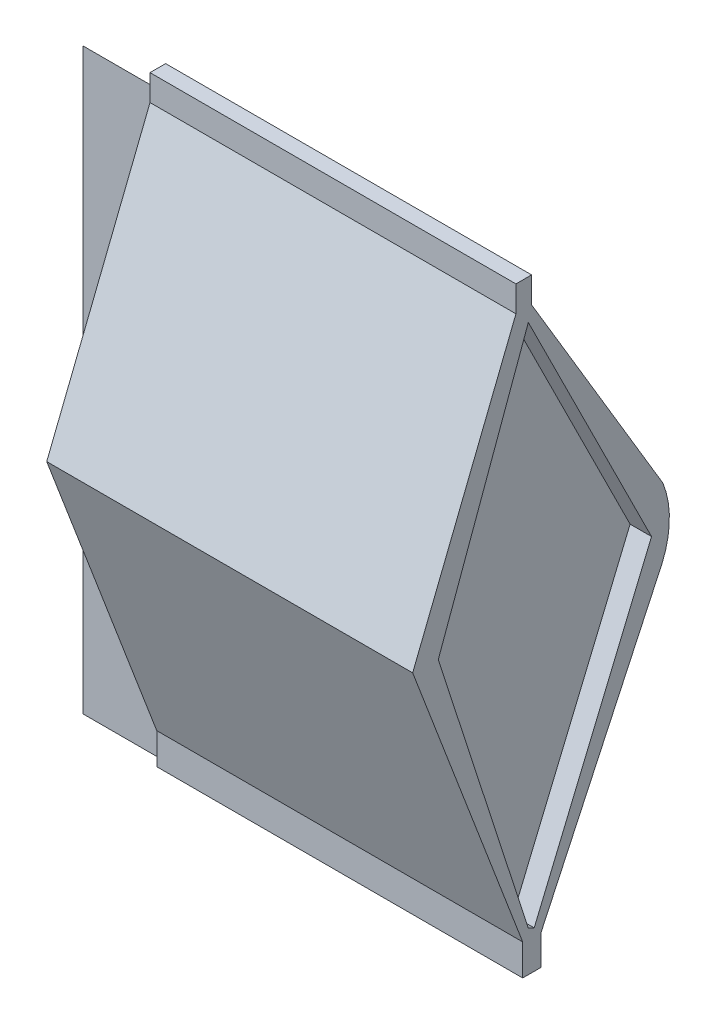
ISO-10303-21;
HEADER;
FILE_DESCRIPTION(('STEP AP214'),'2;1');
FILE_NAME('part.step','',(''),(''),'','','');
FILE_SCHEMA(('AUTOMOTIVE_DESIGN { 1 0 10303 214 1 1 1 1 }'));
ENDSEC;
DATA;
#1=APPLICATION_CONTEXT('core data for automotive mechanical design processes');
#2=APPLICATION_PROTOCOL_DEFINITION('international standard','automotive_design',2000,#1);
#3=PRODUCT_CONTEXT('',#1,'mechanical');
#4=PRODUCT('Part','Part','',(#3));
#5=PRODUCT_RELATED_PRODUCT_CATEGORY('part','',(#4));
#6=PRODUCT_DEFINITION_FORMATION('','',#4);
#7=PRODUCT_DEFINITION_CONTEXT('part definition',#1,'design');
#8=PRODUCT_DEFINITION('design','',#6,#7);
#9=PRODUCT_DEFINITION_SHAPE('','',#8);
#10=(LENGTH_UNIT() NAMED_UNIT(*) SI_UNIT(.MILLI.,.METRE.));
#11=(NAMED_UNIT(*) PLANE_ANGLE_UNIT() SI_UNIT($,.RADIAN.));
#12=(NAMED_UNIT(*) SI_UNIT($,.STERADIAN.) SOLID_ANGLE_UNIT());
#13=UNCERTAINTY_MEASURE_WITH_UNIT(LENGTH_MEASURE(1.E-05),#10,'distance_accuracy_value','');
#14=(GEOMETRIC_REPRESENTATION_CONTEXT(3) GLOBAL_UNCERTAINTY_ASSIGNED_CONTEXT((#13)) GLOBAL_UNIT_ASSIGNED_CONTEXT((#10,
#11,#12)) REPRESENTATION_CONTEXT('',''));
#15=CARTESIAN_POINT('',(0.,0.,0.));
#16=DIRECTION('',(0.,0.,1.));
#17=DIRECTION('',(1.,0.,0.));
#18=AXIS2_PLACEMENT_3D('',#15,#16,#17);
#19=CARTESIAN_POINT('',(-31.4181155350113,42.3611282868526,50.));
#20=DIRECTION('',(1.,0.,0.));
#21=DIRECTION('',(0.,0.,-1.));
#22=AXIS2_PLACEMENT_3D('',#19,#20,#21);
#23=PLANE('',#22);
#24=DIRECTION('',(0.,-1.,0.));
#25=VECTOR('',#24,1.);
#26=CARTESIAN_POINT('',(-31.4181155350113,42.3611282868526,29.6553839692635));
#27=LINE('',#26,#25);
#28=CARTESIAN_POINT('',(-31.4181155350113,38.7225544726135,29.6553839692635));
#29=VERTEX_POINT('',#28);
#30=CARTESIAN_POINT('',(-31.4181155350113,-42.3611282868526,29.6553839692635));
#31=VERTEX_POINT('',#30);
#32=EDGE_CURVE('E291',#29,#31,#27,.T.);
#33=ORIENTED_EDGE('',*,*,#32,.F.);
#34=DIRECTION('',(0.,-0.85862241369767,-0.512608574543957));
#35=VECTOR('',#34,1.);
#36=CARTESIAN_POINT('',(-31.4181155350113,50.3594517276258,36.6027606261541));
#37=LINE('',#36,#35);
#38=CARTESIAN_POINT('',(-31.4181155350113,7.92449718438055,11.2685494382899));
#39=VERTEX_POINT('',#38);
#40=EDGE_CURVE('E179',#29,#39,#37,.T.);
#41=ORIENTED_EDGE('',*,*,#40,.T.);
#42=CARTESIAN_POINT('',(-31.4181155350113,3.18000076873502,22.9457580114657));
#43=DIRECTION('',(1.,0.,0.));
#44=DIRECTION('',(0.,0.,1.));
#45=AXIS2_PLACEMENT_3D('',#42,#43,#44);
#46=CIRCLE('',#45,12.6042630208801);
#47=CARTESIAN_POINT('',(-31.4181155350113,-1.76687908687424,11.3528366370368));
#48=VERTEX_POINT('',#47);
#49=EDGE_CURVE('E229',#48,#39,#46,.T.);
#50=ORIENTED_EDGE('',*,*,#49,.F.);
#51=DIRECTION('',(0.,-0.906069641419884,0.423128591443834));
#52=VECTOR('',#51,1.);
#53=CARTESIAN_POINT('',(-31.4181155350113,19.6438437493998,1.35416922631763));
#54=LINE('',#53,#52);
#55=CARTESIAN_POINT('',(-31.4181155350113,-38.1177449997665,28.3284530668979));
#56=VERTEX_POINT('',#55);
#57=EDGE_CURVE('E40',#48,#56,#54,.T.);
#58=ORIENTED_EDGE('',*,*,#57,.T.);
#59=DIRECTION('',(0.,-1.,0.));
#60=VECTOR('',#59,1.);
#61=CARTESIAN_POINT('',(-31.4181155350113,42.3611282868526,28.3284530668979));
#62=LINE('',#61,#60);
#63=CARTESIAN_POINT('',(-31.4181155350113,-42.3611282868526,28.3284530668979));
#64=VERTEX_POINT('',#63);
#65=EDGE_CURVE('E182',#56,#64,#62,.T.);
#66=ORIENTED_EDGE('',*,*,#65,.T.);
#67=DIRECTION('',(0.,0.,-1.));
#68=VECTOR('',#67,1.);
#69=CARTESIAN_POINT('',(-31.4181155350113,-42.3611282868526,50.));
#70=LINE('',#69,#68);
#71=EDGE_CURVE('E215',#31,#64,#70,.T.);
#72=ORIENTED_EDGE('',*,*,#71,.F.);
#73=EDGE_LOOP('',(#33,#41,#50,#58,#66,#72));
#74=FACE_BOUND('',#73,.T.);
#75=ADVANCED_FACE('F32',(#74),#23,.F.);
#76=CARTESIAN_POINT('',(31.4181155350113,42.3611282868526,50.));
#77=DIRECTION('',(-1.,0.,0.));
#78=DIRECTION('',(0.,0.,1.));
#79=AXIS2_PLACEMENT_3D('',#76,#77,#78);
#80=PLANE('',#79);
#81=DIRECTION('',(0.,-0.939498101775437,0.34255410778496));
#82=VECTOR('',#81,1.);
#83=CARTESIAN_POINT('',(31.4181155350113,36.8174357474018,30.1115989208824));
#84=LINE('',#83,#82);
#85=CARTESIAN_POINT('',(31.4181155350113,36.8174357474018,30.1115989208824));
#86=VERTEX_POINT('',#85);
#87=CARTESIAN_POINT('',(31.4181155350113,2.19595341030754,42.7350741251047));
#88=VERTEX_POINT('',#87);
#89=EDGE_CURVE('E273',#86,#88,#84,.T.);
#90=ORIENTED_EDGE('',*,*,#89,.F.);
#91=DIRECTION('',(0.,0.894888871151744,0.446289041192766));
#92=VECTOR('',#91,1.);
#93=CARTESIAN_POINT('',(31.4181155350113,2.19595341030754,12.8455576782329));
#94=LINE('',#93,#92);
#95=CARTESIAN_POINT('',(31.4181155350113,2.19595341030754,12.8455576782329));
#96=VERTEX_POINT('',#95);
#97=EDGE_CURVE('E55',#96,#86,#94,.T.);
#98=ORIENTED_EDGE('',*,*,#97,.F.);
#99=DIRECTION('',(0.,0.922414525454659,-0.386201298845896));
#100=VECTOR('',#99,1.);
#101=CARTESIAN_POINT('',(31.4181155350113,-37.0782013501156,29.2890645409137));
#102=LINE('',#101,#100);
#103=CARTESIAN_POINT('',(31.4181155350113,-37.0782013501156,29.2890645409137));
#104=VERTEX_POINT('',#103);
#105=EDGE_CURVE('E263',#104,#96,#102,.T.);
#106=ORIENTED_EDGE('',*,*,#105,.F.);
#107=DIRECTION('',(0.,-0.423128591443833,-0.906069641419884));
#108=VECTOR('',#107,1.);
#109=CARTESIAN_POINT('',(31.4181155350113,-36.6940831789506,30.1115989208824));
#110=LINE('',#109,#108);
#111=CARTESIAN_POINT('',(31.4181155350113,-36.6940831789506,30.1115989208824));
#112=VERTEX_POINT('',#111);
#113=EDGE_CURVE('E267',#112,#104,#110,.T.);
#114=ORIENTED_EDGE('',*,*,#113,.F.);
#115=DIRECTION('',(0.,-0.951147499434773,-0.308736836673207));
#116=VECTOR('',#115,1.);
#117=CARTESIAN_POINT('',(31.4181155350113,2.19595341030754,42.7350741251047));
#118=LINE('',#117,#116);
#119=EDGE_CURVE('E270',#88,#112,#118,.T.);
#120=ORIENTED_EDGE('',*,*,#119,.F.);
#121=EDGE_LOOP('',(#90,#98,#106,#114,#120));
#122=FACE_BOUND('',#121,.T.);
#123=DIRECTION('',(0.,-0.906069641419884,0.423128591443834));
#124=VECTOR('',#123,1.);
#125=CARTESIAN_POINT('',(31.4181155350113,3.75015887750862,8.77641602200185));
#126=LINE('',#125,#124);
#127=CARTESIAN_POINT('',(31.4181155350113,-1.76687908687419,11.3528366370367));
#128=VERTEX_POINT('',#127);
#129=CARTESIAN_POINT('',(31.4181155350113,-38.1177449997665,28.3284530668979));
#130=VERTEX_POINT('',#129);
#131=EDGE_CURVE('E239',#128,#130,#126,.T.);
#132=ORIENTED_EDGE('',*,*,#131,.F.);
#133=CARTESIAN_POINT('',(31.4181155350113,3.18000076873502,22.9457580114657));
#134=DIRECTION('',(-1.,0.,0.));
#135=DIRECTION('',(0.,0.,1.));
#136=AXIS2_PLACEMENT_3D('',#133,#134,#135);
#137=CIRCLE('',#136,12.6042630208801);
#138=CARTESIAN_POINT('',(31.4181155350113,7.92449718438057,11.2685494382899));
#139=VERTEX_POINT('',#138);
#140=EDGE_CURVE('E249',#128,#139,#137,.F.);
#141=ORIENTED_EDGE('',*,*,#140,.T.);
#142=DIRECTION('',(0.,-0.85862241369767,-0.512608574543957));
#143=VECTOR('',#142,1.);
#144=CARTESIAN_POINT('',(31.4181155350113,38.7225544726135,29.6553839692635));
#145=LINE('',#144,#143);
#146=CARTESIAN_POINT('',(31.4181155350113,38.7225544726135,29.6553839692635));
#147=VERTEX_POINT('',#146);
#148=EDGE_CURVE('E243',#147,#139,#145,.T.);
#149=ORIENTED_EDGE('',*,*,#148,.F.);
#150=DIRECTION('',(0.,-1.,0.));
#151=VECTOR('',#150,1.);
#152=CARTESIAN_POINT('',(31.4181155350113,42.3611282868526,29.6553839692635));
#153=LINE('',#152,#151);
#154=CARTESIAN_POINT('',(31.4181155350113,42.3611282868526,29.6553839692635));
#155=VERTEX_POINT('',#154);
#156=EDGE_CURVE('E172',#155,#147,#153,.T.);
#157=ORIENTED_EDGE('',*,*,#156,.F.);
#158=DIRECTION('',(0.,0.,-1.));
#159=VECTOR('',#158,1.);
#160=CARTESIAN_POINT('',(31.4181155350113,42.3611282868526,50.));
#161=LINE('',#160,#159);
#162=CARTESIAN_POINT('',(31.4181155350113,42.3611282868526,31.846034256688));
#163=VERTEX_POINT('',#162);
#164=EDGE_CURVE('E217',#163,#155,#161,.T.);
#165=ORIENTED_EDGE('',*,*,#164,.F.);
#166=DIRECTION('',(0.,-1.,0.));
#167=VECTOR('',#166,1.);
#168=CARTESIAN_POINT('',(31.4181155350113,0.,31.846034256688));
#169=LINE('',#168,#167);
#170=CARTESIAN_POINT('',(31.4181155350113,38.7281740079146,31.846034256688));
#171=VERTEX_POINT('',#170);
#172=EDGE_CURVE('E193',#163,#171,#169,.T.);
#173=ORIENTED_EDGE('',*,*,#172,.T.);
#174=DIRECTION('',(0.,-0.928999989043887,0.370079748644069));
#175=VECTOR('',#174,1.);
#176=CARTESIAN_POINT('',(31.4181155350113,16.252969359155,40.7993369318552));
#177=LINE('',#176,#175);
#178=CARTESIAN_POINT('',(31.4181155350113,2.38891708981726,46.3222702359829));
#179=VERTEX_POINT('',#178);
#180=EDGE_CURVE('E190',#171,#179,#177,.T.);
#181=ORIENTED_EDGE('',*,*,#180,.T.);
#182=DIRECTION('',(0.,-0.934146484006521,-0.356889823920849));
#183=VECTOR('',#182,1.);
#184=CARTESIAN_POINT('',(31.4181155350113,-15.1389828433554,39.6257518334059));
#185=LINE('',#184,#183);
#186=CARTESIAN_POINT('',(31.4181155350113,-37.9824267264439,30.8984346462609));
#187=VERTEX_POINT('',#186);
#188=EDGE_CURVE('E199',#179,#187,#185,.T.);
#189=ORIENTED_EDGE('',*,*,#188,.T.);
#190=DIRECTION('',(0.,-1.,0.));
#191=VECTOR('',#190,1.);
#192=CARTESIAN_POINT('',(31.4181155350113,0.,30.8984346462609));
#193=LINE('',#192,#191);
#194=CARTESIAN_POINT('',(31.4181155350113,-42.3611282868526,30.8984346462609));
#195=VERTEX_POINT('',#194);
#196=EDGE_CURVE('E196',#187,#195,#193,.T.);
#197=ORIENTED_EDGE('',*,*,#196,.T.);
#198=DIRECTION('',(0.,0.,-1.));
#199=VECTOR('',#198,1.);
#200=CARTESIAN_POINT('',(31.4181155350113,-42.3611282868526,50.));
#201=LINE('',#200,#199);
#202=CARTESIAN_POINT('',(31.4181155350113,-42.3611282868526,28.3284530668979));
#203=VERTEX_POINT('',#202);
#204=EDGE_CURVE('E205',#195,#203,#201,.T.);
#205=ORIENTED_EDGE('',*,*,#204,.T.);
#206=DIRECTION('',(0.,-1.,0.));
#207=VECTOR('',#206,1.);
#208=CARTESIAN_POINT('',(31.4181155350113,-38.1177449997665,28.3284530668979));
#209=LINE('',#208,#207);
#210=EDGE_CURVE('E187',#130,#203,#209,.T.);
#211=ORIENTED_EDGE('',*,*,#210,.F.);
#212=EDGE_LOOP('',(#132,#141,#149,#157,#165,#173,#181,#189,#197,#205,#211));
#213=FACE_BOUND('',#212,.T.);
#214=ADVANCED_FACE('F34',(#122,#213),#80,.F.);
#215=CARTESIAN_POINT('',(-31.4181155350113,42.3611282868526,50.));
#216=DIRECTION('',(0.,-1.,0.));
#217=DIRECTION('',(0.,0.,-1.));
#218=AXIS2_PLACEMENT_3D('',#215,#216,#217);
#219=PLANE('',#218);
#220=DIRECTION('',(1.,0.,0.));
#221=VECTOR('',#220,1.);
#222=CARTESIAN_POINT('',(-48.5818844649887,42.3611282868526,29.6553839692635));
#223=LINE('',#222,#221);
#224=CARTESIAN_POINT('',(-19.8699083028941,42.3611282868526,29.6553839692635));
#225=VERTEX_POINT('',#224);
#226=EDGE_CURVE('E175',#225,#155,#223,.T.);
#227=ORIENTED_EDGE('',*,*,#226,.F.);
#228=DIRECTION('',(0.,0.,-1.));
#229=VECTOR('',#228,1.);
#230=CARTESIAN_POINT('',(-19.8699083028941,42.3611282868526,109.655383969263));
#231=LINE('',#230,#229);
#232=CARTESIAN_POINT('',(-19.8699083028941,42.3611282868526,31.846034256688));
#233=VERTEX_POINT('',#232);
#234=EDGE_CURVE('E47',#233,#225,#231,.T.);
#235=ORIENTED_EDGE('',*,*,#234,.F.);
#236=DIRECTION('',(1.,0.,0.));
#237=VECTOR('',#236,1.);
#238=CARTESIAN_POINT('',(-48.5818844649887,42.3611282868526,31.846034256688));
#239=LINE('',#238,#237);
#240=EDGE_CURVE('E210',#233,#163,#239,.T.);
#241=ORIENTED_EDGE('',*,*,#240,.T.);
#242=ORIENTED_EDGE('',*,*,#164,.T.);
#243=EDGE_LOOP('',(#227,#235,#241,#242));
#244=FACE_BOUND('',#243,.T.);
#245=ADVANCED_FACE('F327',(#244),#219,.F.);
#246=CARTESIAN_POINT('',(-31.4181155350113,-42.3611282868526,50.));
#247=DIRECTION('',(0.,1.,0.));
#248=DIRECTION('',(0.,0.,1.));
#249=AXIS2_PLACEMENT_3D('',#246,#247,#248);
#250=PLANE('',#249);
#251=DIRECTION('',(1.,0.,0.));
#252=VECTOR('',#251,1.);
#253=CARTESIAN_POINT('',(-48.5818844649887,-42.3611282868526,30.8984346462609));
#254=LINE('',#253,#252);
#255=CARTESIAN_POINT('',(-19.8699083028941,-42.3611282868526,30.8984346462609));
#256=VERTEX_POINT('',#255);
#257=EDGE_CURVE('E208',#256,#195,#254,.T.);
#258=ORIENTED_EDGE('',*,*,#257,.F.);
#259=DIRECTION('',(0.,0.,-1.));
#260=VECTOR('',#259,1.);
#261=CARTESIAN_POINT('',(-19.8699083028941,-42.3611282868526,50.));
#262=LINE('',#261,#260);
#263=CARTESIAN_POINT('',(-19.8699083028941,-42.3611282868526,29.6553839692635));
#264=VERTEX_POINT('',#263);
#265=EDGE_CURVE('E295',#256,#264,#262,.T.);
#266=ORIENTED_EDGE('',*,*,#265,.T.);
#267=DIRECTION('',(1.,0.,0.));
#268=VECTOR('',#267,1.);
#269=CARTESIAN_POINT('',(-31.4181155350113,-42.3611282868526,29.6553839692635));
#270=LINE('',#269,#268);
#271=EDGE_CURVE('E160',#31,#264,#270,.T.);
#272=ORIENTED_EDGE('',*,*,#271,.F.);
#273=ORIENTED_EDGE('',*,*,#71,.T.);
#274=DIRECTION('',(1.,0.,0.));
#275=VECTOR('',#274,1.);
#276=CARTESIAN_POINT('',(-31.4181155350113,-42.3611282868526,28.3284530668979));
#277=LINE('',#276,#275);
#278=EDGE_CURVE('E220',#64,#203,#277,.T.);
#279=ORIENTED_EDGE('',*,*,#278,.T.);
#280=ORIENTED_EDGE('',*,*,#204,.F.);
#281=EDGE_LOOP('',(#258,#266,#272,#273,#279,#280));
#282=FACE_BOUND('',#281,.T.);
#283=ADVANCED_FACE('F348',(#282),#250,.F.);
#284=CARTESIAN_POINT('',(-48.5818844649887,16.252969359155,40.7993369318552));
#285=DIRECTION('',(0.,0.370079748644069,0.928999989043887));
#286=DIRECTION('',(0.,-0.928999989043887,0.370079748644069));
#287=AXIS2_PLACEMENT_3D('',#284,#285,#286);
#288=PLANE('',#287);
#289=DIRECTION('',(0.,0.928999989043887,-0.370079748644069));
#290=VECTOR('',#289,1.);
#291=CARTESIAN_POINT('',(-19.8699083028941,16.252969359155,40.7993369318552));
#292=LINE('',#291,#290);
#293=CARTESIAN_POINT('',(-19.8699083028941,2.38891708981726,46.3222702359829));
#294=VERTEX_POINT('',#293);
#295=CARTESIAN_POINT('',(-19.8699083028941,38.7281740079146,31.846034256688));
#296=VERTEX_POINT('',#295);
#297=EDGE_CURVE('E297',#294,#296,#292,.T.);
#298=ORIENTED_EDGE('',*,*,#297,.F.);
#299=DIRECTION('',(1.,0.,0.));
#300=VECTOR('',#299,1.);
#301=CARTESIAN_POINT('',(-48.5818844649887,2.38891708981726,46.3222702359829));
#302=LINE('',#301,#300);
#303=EDGE_CURVE('E203',#294,#179,#302,.T.);
#304=ORIENTED_EDGE('',*,*,#303,.T.);
#305=ORIENTED_EDGE('',*,*,#180,.F.);
#306=DIRECTION('',(1.,0.,0.));
#307=VECTOR('',#306,1.);
#308=CARTESIAN_POINT('',(-48.5818844649887,38.7281740079146,31.846034256688));
#309=LINE('',#308,#307);
#310=EDGE_CURVE('E202',#296,#171,#309,.T.);
#311=ORIENTED_EDGE('',*,*,#310,.F.);
#312=EDGE_LOOP('',(#298,#304,#305,#311));
#313=FACE_BOUND('',#312,.T.);
#314=ADVANCED_FACE('F321',(#313),#288,.T.);
#315=CARTESIAN_POINT('',(-48.5818844649887,-15.1389828433554,39.6257518334059));
#316=DIRECTION('',(0.,-0.356889823920849,0.934146484006521));
#317=DIRECTION('',(0.,-0.934146484006521,-0.356889823920849));
#318=AXIS2_PLACEMENT_3D('',#315,#316,#317);
#319=PLANE('',#318);
#320=DIRECTION('',(0.,0.934146484006521,0.356889823920849));
#321=VECTOR('',#320,1.);
#322=CARTESIAN_POINT('',(-19.8699083028941,-15.1389828433554,39.6257518334059));
#323=LINE('',#322,#321);
#324=CARTESIAN_POINT('',(-19.8699083028941,-37.9824267264439,30.8984346462609));
#325=VERTEX_POINT('',#324);
#326=EDGE_CURVE('E299',#325,#294,#323,.T.);
#327=ORIENTED_EDGE('',*,*,#326,.F.);
#328=DIRECTION('',(1.,0.,0.));
#329=VECTOR('',#328,1.);
#330=CARTESIAN_POINT('',(-48.5818844649887,-37.9824267264439,30.8984346462609));
#331=LINE('',#330,#329);
#332=EDGE_CURVE('E206',#325,#187,#331,.T.);
#333=ORIENTED_EDGE('',*,*,#332,.T.);
#334=ORIENTED_EDGE('',*,*,#188,.F.);
#335=ORIENTED_EDGE('',*,*,#303,.F.);
#336=EDGE_LOOP('',(#327,#333,#334,#335));
#337=FACE_BOUND('',#336,.T.);
#338=ADVANCED_FACE('F311',(#337),#319,.T.);
#339=CARTESIAN_POINT('',(-48.5818844649887,0.,31.846034256688));
#340=DIRECTION('',(0.,0.,1.));
#341=DIRECTION('',(1.,0.,0.));
#342=AXIS2_PLACEMENT_3D('',#339,#340,#341);
#343=PLANE('',#342);
#344=DIRECTION('',(0.,1.,0.));
#345=VECTOR('',#344,1.);
#346=CARTESIAN_POINT('',(-19.8699083028941,0.,31.846034256688));
#347=LINE('',#346,#345);
#348=EDGE_CURVE('E293',#296,#233,#347,.T.);
#349=ORIENTED_EDGE('',*,*,#348,.F.);
#350=ORIENTED_EDGE('',*,*,#310,.T.);
#351=ORIENTED_EDGE('',*,*,#172,.F.);
#352=ORIENTED_EDGE('',*,*,#240,.F.);
#353=EDGE_LOOP('',(#349,#350,#351,#352));
#354=FACE_BOUND('',#353,.T.);
#355=ADVANCED_FACE('F325',(#354),#343,.T.);
#356=CARTESIAN_POINT('',(-48.5818844649887,0.,30.8984346462609));
#357=DIRECTION('',(0.,0.,1.));
#358=DIRECTION('',(1.,0.,0.));
#359=AXIS2_PLACEMENT_3D('',#356,#357,#358);
#360=PLANE('',#359);
#361=DIRECTION('',(0.,1.,0.));
#362=VECTOR('',#361,1.);
#363=CARTESIAN_POINT('',(-19.8699083028941,0.,30.8984346462609));
#364=LINE('',#363,#362);
#365=EDGE_CURVE('E301',#256,#325,#364,.T.);
#366=ORIENTED_EDGE('',*,*,#365,.F.);
#367=ORIENTED_EDGE('',*,*,#257,.T.);
#368=ORIENTED_EDGE('',*,*,#196,.F.);
#369=ORIENTED_EDGE('',*,*,#332,.F.);
#370=EDGE_LOOP('',(#366,#367,#368,#369));
#371=FACE_BOUND('',#370,.T.);
#372=ADVANCED_FACE('F314',(#371),#360,.T.);
#373=CARTESIAN_POINT('',(-48.5818844649887,3.75015887750862,8.77641602200185));
#374=DIRECTION('',(0.,0.423128591443834,0.906069641419884));
#375=DIRECTION('',(0.,-0.906069641419884,0.423128591443834));
#376=AXIS2_PLACEMENT_3D('',#373,#374,#375);
#377=PLANE('',#376);
#378=ORIENTED_EDGE('',*,*,#57,.F.);
#379=DIRECTION('',(-1.,0.,0.));
#380=VECTOR('',#379,1.);
#381=CARTESIAN_POINT('',(48.5818844649887,-1.76687908687424,11.3528366370368));
#382=LINE('',#381,#380);
#383=EDGE_CURVE('E240',#48,#128,#382,.F.);
#384=ORIENTED_EDGE('',*,*,#383,.T.);
#385=ORIENTED_EDGE('',*,*,#131,.T.);
#386=DIRECTION('',(1.,0.,0.));
#387=VECTOR('',#386,1.);
#388=CARTESIAN_POINT('',(-48.5818844649887,-38.1177449997665,28.3284530668979));
#389=LINE('',#388,#387);
#390=EDGE_CURVE('E180',#56,#130,#389,.T.);
#391=ORIENTED_EDGE('',*,*,#390,.F.);
#392=EDGE_LOOP('',(#378,#384,#385,#391));
#393=FACE_BOUND('',#392,.T.);
#394=ADVANCED_FACE('F237',(#393),#377,.F.);
#395=CARTESIAN_POINT('',(-48.5818844649887,38.7225544726135,29.6553839692635));
#396=DIRECTION('',(0.,-0.512608574543957,0.85862241369767));
#397=DIRECTION('',(0.,-0.85862241369767,-0.512608574543957));
#398=AXIS2_PLACEMENT_3D('',#395,#396,#397);
#399=PLANE('',#398);
#400=DIRECTION('',(-1.,0.,0.));
#401=VECTOR('',#400,1.);
#402=CARTESIAN_POINT('',(48.5818844649887,7.92449718438057,11.2685494382899));
#403=LINE('',#402,#401);
#404=EDGE_CURVE('E11',#139,#39,#403,.T.);
#405=ORIENTED_EDGE('',*,*,#404,.T.);
#406=ORIENTED_EDGE('',*,*,#40,.F.);
#407=DIRECTION('',(1.,0.,0.));
#408=VECTOR('',#407,1.);
#409=CARTESIAN_POINT('',(-48.5818844649887,38.7225544726135,29.6553839692635));
#410=LINE('',#409,#408);
#411=CARTESIAN_POINT('',(-19.8699083028941,38.7225544726135,29.6553839692635));
#412=VERTEX_POINT('',#411);
#413=EDGE_CURVE('E157',#29,#412,#410,.T.);
#414=ORIENTED_EDGE('',*,*,#413,.T.);
#415=EDGE_CURVE('E169',#412,#147,#410,.T.);
#416=ORIENTED_EDGE('',*,*,#415,.T.);
#417=ORIENTED_EDGE('',*,*,#148,.T.);
#418=EDGE_LOOP('',(#405,#406,#414,#416,#417));
#419=FACE_BOUND('',#418,.T.);
#420=ADVANCED_FACE('F178',(#419),#399,.F.);
#421=CARTESIAN_POINT('',(-48.5818844649887,42.3611282868526,29.6553839692635));
#422=DIRECTION('',(0.,0.,1.));
#423=DIRECTION('',(1.,0.,0.));
#424=AXIS2_PLACEMENT_3D('',#421,#422,#423);
#425=PLANE('',#424);
#426=ORIENTED_EDGE('',*,*,#415,.F.);
#427=DIRECTION('',(0.,-1.,0.));
#428=VECTOR('',#427,1.);
#429=CARTESIAN_POINT('',(-19.8699083028941,-42.0597591958796,29.6553839692635));
#430=LINE('',#429,#428);
#431=EDGE_CURVE('E162',#225,#412,#430,.T.);
#432=ORIENTED_EDGE('',*,*,#431,.F.);
#433=ORIENTED_EDGE('',*,*,#226,.T.);
#434=ORIENTED_EDGE('',*,*,#156,.T.);
#435=EDGE_LOOP('',(#426,#432,#433,#434));
#436=FACE_BOUND('',#435,.T.);
#437=ADVANCED_FACE('F170',(#436),#425,.F.);
#438=CARTESIAN_POINT('',(-48.5818844649887,-38.1177449997665,28.3284530668979));
#439=DIRECTION('',(0.,0.,1.));
#440=DIRECTION('',(1.,0.,0.));
#441=AXIS2_PLACEMENT_3D('',#438,#439,#440);
#442=PLANE('',#441);
#443=ORIENTED_EDGE('',*,*,#390,.T.);
#444=ORIENTED_EDGE('',*,*,#210,.T.);
#445=ORIENTED_EDGE('',*,*,#278,.F.);
#446=ORIENTED_EDGE('',*,*,#65,.F.);
#447=EDGE_LOOP('',(#443,#444,#445,#446));
#448=FACE_BOUND('',#447,.T.);
#449=ADVANCED_FACE('F235',(#448),#442,.F.);
#450=CARTESIAN_POINT('',(48.5818844649887,3.18000076873502,22.9457580114657));
#451=DIRECTION('',(-1.,0.,0.));
#452=DIRECTION('',(0.,0.,1.));
#453=AXIS2_PLACEMENT_3D('',#450,#451,#452);
#454=CYLINDRICAL_SURFACE('',#453,12.6042630208801);
#455=ORIENTED_EDGE('',*,*,#49,.T.);
#456=ORIENTED_EDGE('',*,*,#404,.F.);
#457=ORIENTED_EDGE('',*,*,#140,.F.);
#458=ORIENTED_EDGE('',*,*,#383,.F.);
#459=EDGE_LOOP('',(#455,#456,#457,#458));
#460=FACE_BOUND('',#459,.T.);
#461=ADVANCED_FACE('F330',(#460),#454,.T.);
#462=CARTESIAN_POINT('',(28.4181155350113,2.19595341030754,12.8455576782329));
#463=DIRECTION('',(0.,0.446289041192766,-0.894888871151744));
#464=DIRECTION('',(0.,0.894888871151744,0.446289041192766));
#465=AXIS2_PLACEMENT_3D('',#462,#463,#464);
#466=PLANE('',#465);
#467=ORIENTED_EDGE('',*,*,#97,.T.);
#468=DIRECTION('',(1.,0.,0.));
#469=VECTOR('',#468,1.);
#470=CARTESIAN_POINT('',(28.4181155350113,36.8174357474018,30.1115989208824));
#471=LINE('',#470,#469);
#472=CARTESIAN_POINT('',(28.4181155350113,36.8174357474018,30.1115989208824));
#473=VERTEX_POINT('',#472);
#474=EDGE_CURVE('E253',#473,#86,#471,.T.);
#475=ORIENTED_EDGE('',*,*,#474,.F.);
#476=DIRECTION('',(0.,0.894888871151744,0.446289041192766));
#477=VECTOR('',#476,1.);
#478=CARTESIAN_POINT('',(28.4181155350113,2.19595341030754,12.8455576782329));
#479=LINE('',#478,#477);
#480=CARTESIAN_POINT('',(28.4181155350113,2.19595341030754,12.8455576782329));
#481=VERTEX_POINT('',#480);
#482=EDGE_CURVE('E266',#481,#473,#479,.T.);
#483=ORIENTED_EDGE('',*,*,#482,.F.);
#484=DIRECTION('',(1.,0.,0.));
#485=VECTOR('',#484,1.);
#486=CARTESIAN_POINT('',(28.4181155350113,2.19595341030754,12.8455576782329));
#487=LINE('',#486,#485);
#488=EDGE_CURVE('E252',#481,#96,#487,.T.);
#489=ORIENTED_EDGE('',*,*,#488,.T.);
#490=EDGE_LOOP('',(#467,#475,#483,#489));
#491=FACE_BOUND('',#490,.T.);
#492=ADVANCED_FACE('F332',(#491),#466,.F.);
#493=CARTESIAN_POINT('',(28.4181155350113,-37.0782013501156,29.2890645409137));
#494=DIRECTION('',(0.,-0.386201298845896,-0.922414525454659));
#495=DIRECTION('',(0.,0.922414525454659,-0.386201298845896));
#496=AXIS2_PLACEMENT_3D('',#493,#494,#495);
#497=PLANE('',#496);
#498=ORIENTED_EDGE('',*,*,#105,.T.);
#499=ORIENTED_EDGE('',*,*,#488,.F.);
#500=DIRECTION('',(0.,0.922414525454659,-0.386201298845896));
#501=VECTOR('',#500,1.);
#502=CARTESIAN_POINT('',(28.4181155350113,-37.0782013501156,29.2890645409137));
#503=LINE('',#502,#501);
#504=CARTESIAN_POINT('',(28.4181155350113,-37.0782013501156,29.2890645409137));
#505=VERTEX_POINT('',#504);
#506=EDGE_CURVE('E256',#505,#481,#503,.T.);
#507=ORIENTED_EDGE('',*,*,#506,.F.);
#508=DIRECTION('',(1.,0.,0.));
#509=VECTOR('',#508,1.);
#510=CARTESIAN_POINT('',(28.4181155350113,-37.0782013501156,29.2890645409137));
#511=LINE('',#510,#509);
#512=EDGE_CURVE('E260',#505,#104,#511,.T.);
#513=ORIENTED_EDGE('',*,*,#512,.T.);
#514=EDGE_LOOP('',(#498,#499,#507,#513));
#515=FACE_BOUND('',#514,.T.);
#516=ADVANCED_FACE('F338',(#515),#497,.F.);
#517=CARTESIAN_POINT('',(28.4181155350113,-36.6940831789506,30.1115989208824));
#518=DIRECTION('',(0.,-0.906069641419884,0.423128591443833));
#519=DIRECTION('',(0.,-0.423128591443833,-0.906069641419884));
#520=AXIS2_PLACEMENT_3D('',#517,#518,#519);
#521=PLANE('',#520);
#522=ORIENTED_EDGE('',*,*,#113,.T.);
#523=ORIENTED_EDGE('',*,*,#512,.F.);
#524=DIRECTION('',(0.,-0.423128591443833,-0.906069641419884));
#525=VECTOR('',#524,1.);
#526=CARTESIAN_POINT('',(28.4181155350113,-36.6940831789506,30.1115989208824));
#527=LINE('',#526,#525);
#528=CARTESIAN_POINT('',(28.4181155350113,-36.6940831789506,30.1115989208824));
#529=VERTEX_POINT('',#528);
#530=EDGE_CURVE('E279',#529,#505,#527,.T.);
#531=ORIENTED_EDGE('',*,*,#530,.F.);
#532=DIRECTION('',(1.,0.,0.));
#533=VECTOR('',#532,1.);
#534=CARTESIAN_POINT('',(28.4181155350113,-36.6940831789506,30.1115989208824));
#535=LINE('',#534,#533);
#536=EDGE_CURVE('E258',#529,#112,#535,.T.);
#537=ORIENTED_EDGE('',*,*,#536,.T.);
#538=EDGE_LOOP('',(#522,#523,#531,#537));
#539=FACE_BOUND('',#538,.T.);
#540=ADVANCED_FACE('F415',(#539),#521,.F.);
#541=CARTESIAN_POINT('',(28.4181155350113,2.19595341030754,42.7350741251047));
#542=DIRECTION('',(0.,-0.308736836673207,0.951147499434773));
#543=DIRECTION('',(0.,-0.951147499434773,-0.308736836673207));
#544=AXIS2_PLACEMENT_3D('',#541,#542,#543);
#545=PLANE('',#544);
#546=ORIENTED_EDGE('',*,*,#119,.T.);
#547=ORIENTED_EDGE('',*,*,#536,.F.);
#548=DIRECTION('',(0.,-0.951147499434773,-0.308736836673207));
#549=VECTOR('',#548,1.);
#550=CARTESIAN_POINT('',(28.4181155350113,2.19595341030754,42.7350741251047));
#551=LINE('',#550,#549);
#552=CARTESIAN_POINT('',(28.4181155350113,2.19595341030754,42.7350741251047));
#553=VERTEX_POINT('',#552);
#554=EDGE_CURVE('E282',#553,#529,#551,.T.);
#555=ORIENTED_EDGE('',*,*,#554,.F.);
#556=DIRECTION('',(1.,0.,0.));
#557=VECTOR('',#556,1.);
#558=CARTESIAN_POINT('',(28.4181155350113,2.19595341030754,42.7350741251047));
#559=LINE('',#558,#557);
#560=EDGE_CURVE('E255',#553,#88,#559,.T.);
#561=ORIENTED_EDGE('',*,*,#560,.T.);
#562=EDGE_LOOP('',(#546,#547,#555,#561));
#563=FACE_BOUND('',#562,.T.);
#564=ADVANCED_FACE('F424',(#563),#545,.F.);
#565=CARTESIAN_POINT('',(28.4181155350113,36.8174357474018,30.1115989208824));
#566=DIRECTION('',(0.,0.34255410778496,0.939498101775437));
#567=DIRECTION('',(0.,-0.939498101775437,0.34255410778496));
#568=AXIS2_PLACEMENT_3D('',#565,#566,#567);
#569=PLANE('',#568);
#570=ORIENTED_EDGE('',*,*,#89,.T.);
#571=ORIENTED_EDGE('',*,*,#560,.F.);
#572=DIRECTION('',(0.,-0.939498101775437,0.34255410778496));
#573=VECTOR('',#572,1.);
#574=CARTESIAN_POINT('',(28.4181155350113,36.8174357474018,30.1115989208824));
#575=LINE('',#574,#573);
#576=EDGE_CURVE('E285',#473,#553,#575,.T.);
#577=ORIENTED_EDGE('',*,*,#576,.F.);
#578=ORIENTED_EDGE('',*,*,#474,.T.);
#579=EDGE_LOOP('',(#570,#571,#577,#578));
#580=FACE_BOUND('',#579,.T.);
#581=ADVANCED_FACE('F433',(#580),#569,.F.);
#582=CARTESIAN_POINT('',(28.4181155350113,0.,0.));
#583=DIRECTION('',(-1.,0.,0.));
#584=DIRECTION('',(0.,0.,1.));
#585=AXIS2_PLACEMENT_3D('',#582,#583,#584);
#586=PLANE('',#585);
#587=ORIENTED_EDGE('',*,*,#482,.T.);
#588=ORIENTED_EDGE('',*,*,#576,.T.);
#589=ORIENTED_EDGE('',*,*,#554,.T.);
#590=ORIENTED_EDGE('',*,*,#530,.T.);
#591=ORIENTED_EDGE('',*,*,#506,.T.);
#592=EDGE_LOOP('',(#587,#588,#589,#590,#591));
#593=FACE_BOUND('',#592,.T.);
#594=ADVANCED_FACE('F442',(#593),#586,.F.);
#595=CARTESIAN_POINT('',(0.,0.,29.6553839692635));
#596=DIRECTION('',(0.,0.,1.));
#597=DIRECTION('',(1.,0.,0.));
#598=AXIS2_PLACEMENT_3D('',#595,#596,#597);
#599=PLANE('',#598);
#600=ORIENTED_EDGE('',*,*,#271,.T.);
#601=EDGE_CURVE('E154',#412,#264,#430,.T.);
#602=ORIENTED_EDGE('',*,*,#601,.F.);
#603=ORIENTED_EDGE('',*,*,#413,.F.);
#604=ORIENTED_EDGE('',*,*,#32,.T.);
#605=EDGE_LOOP('',(#600,#602,#603,#604));
#606=FACE_BOUND('',#605,.T.);
#607=ADVANCED_FACE('F155',(#606),#599,.T.);
#608=CARTESIAN_POINT('',(-19.8699083028941,-42.0597591958796,109.655383969263));
#609=DIRECTION('',(1.,0.,0.));
#610=DIRECTION('',(0.,0.,-1.));
#611=AXIS2_PLACEMENT_3D('',#608,#609,#610);
#612=PLANE('',#611);
#613=ORIENTED_EDGE('',*,*,#348,.T.);
#614=ORIENTED_EDGE('',*,*,#234,.T.);
#615=ORIENTED_EDGE('',*,*,#431,.T.);
#616=ORIENTED_EDGE('',*,*,#601,.T.);
#617=ORIENTED_EDGE('',*,*,#265,.F.);
#618=ORIENTED_EDGE('',*,*,#365,.T.);
#619=ORIENTED_EDGE('',*,*,#326,.T.);
#620=ORIENTED_EDGE('',*,*,#297,.T.);
#621=EDGE_LOOP('',(#613,#614,#615,#616,#617,#618,#619,#620));
#622=FACE_BOUND('',#621,.T.);
#623=ADVANCED_FACE('F165',(#622),#612,.F.);
#624=CLOSED_SHELL('',(#75,#214,#245,#283,#314,#338,#355,#372,#394,#420,#437,#449,#461,#492,#516,
#540,#564,#581,#594,#607,#623));
#625=MANIFOLD_SOLID_BREP('B2',#624);
#626=ADVANCED_BREP_SHAPE_REPRESENTATION('',(#18,#625),#14);
#627=SHAPE_DEFINITION_REPRESENTATION(#9,#626);
ENDSEC;
END-ISO-10303-21;
